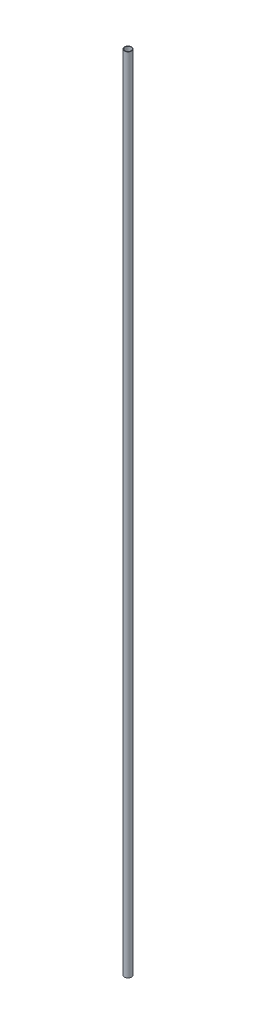
ISO-10303-21;
HEADER;
FILE_DESCRIPTION(('STEP AP214'),'2;1');
FILE_NAME('part.step','',(''),(''),'','','');
FILE_SCHEMA(('AUTOMOTIVE_DESIGN { 1 0 10303 214 1 1 1 1 }'));
ENDSEC;
DATA;
#1=APPLICATION_CONTEXT('core data for automotive mechanical design processes');
#2=APPLICATION_PROTOCOL_DEFINITION('international standard','automotive_design',2000,#1);
#3=PRODUCT_CONTEXT('',#1,'mechanical');
#4=PRODUCT('Part','Part','',(#3));
#5=PRODUCT_RELATED_PRODUCT_CATEGORY('part','',(#4));
#6=PRODUCT_DEFINITION_FORMATION('','',#4);
#7=PRODUCT_DEFINITION_CONTEXT('part definition',#1,'design');
#8=PRODUCT_DEFINITION('design','',#6,#7);
#9=PRODUCT_DEFINITION_SHAPE('','',#8);
#10=(LENGTH_UNIT() NAMED_UNIT(*) SI_UNIT(.MILLI.,.METRE.));
#11=(NAMED_UNIT(*) PLANE_ANGLE_UNIT() SI_UNIT($,.RADIAN.));
#12=(NAMED_UNIT(*) SI_UNIT($,.STERADIAN.) SOLID_ANGLE_UNIT());
#13=UNCERTAINTY_MEASURE_WITH_UNIT(LENGTH_MEASURE(1.E-05),#10,'distance_accuracy_value','');
#14=(GEOMETRIC_REPRESENTATION_CONTEXT(3) GLOBAL_UNCERTAINTY_ASSIGNED_CONTEXT((#13)) GLOBAL_UNIT_ASSIGNED_CONTEXT((#10,
#11,#12)) REPRESENTATION_CONTEXT('',''));
#15=CARTESIAN_POINT('',(0.,0.,0.));
#16=DIRECTION('',(0.,0.,1.));
#17=DIRECTION('',(1.,0.,0.));
#18=AXIS2_PLACEMENT_3D('',#15,#16,#17);
#19=CARTESIAN_POINT('',(0.,891.83,0.));
#20=DIRECTION('',(0.,1.,0.));
#21=DIRECTION('',(0.,0.,1.));
#22=AXIS2_PLACEMENT_3D('',#19,#20,#21);
#23=PLANE('',#22);
#24=CARTESIAN_POINT('',(0.,891.83,0.));
#25=DIRECTION('',(0.,1.,0.));
#26=DIRECTION('',(0.,0.,1.));
#27=AXIS2_PLACEMENT_3D('',#24,#25,#26);
#28=CIRCLE('',#27,4.);
#29=CARTESIAN_POINT('',(0.,891.83,4.));
#30=VERTEX_POINT('',#29);
#31=EDGE_CURVE('E10',#30,#30,#28,.T.);
#32=ORIENTED_EDGE('',*,*,#31,.T.);
#33=EDGE_LOOP('',(#32));
#34=FACE_BOUND('',#33,.T.);
#35=CARTESIAN_POINT('',(0.,891.83,0.));
#36=DIRECTION('',(0.,1.,0.));
#37=DIRECTION('',(0.,0.,1.));
#38=AXIS2_PLACEMENT_3D('',#35,#36,#37);
#39=CIRCLE('',#38,3.5);
#40=CARTESIAN_POINT('',(0.,891.83,3.5));
#41=VERTEX_POINT('',#40);
#42=EDGE_CURVE('E39',#41,#41,#39,.T.);
#43=ORIENTED_EDGE('',*,*,#42,.F.);
#44=EDGE_LOOP('',(#43));
#45=FACE_BOUND('',#44,.T.);
#46=ADVANCED_FACE('F28',(#34,#45),#23,.T.);
#47=CARTESIAN_POINT('',(0.,0.,0.));
#48=DIRECTION('',(0.,1.,0.));
#49=DIRECTION('',(0.,0.,1.));
#50=AXIS2_PLACEMENT_3D('',#47,#48,#49);
#51=PLANE('',#50);
#52=CARTESIAN_POINT('',(0.,0.,0.));
#53=DIRECTION('',(0.,1.,0.));
#54=DIRECTION('',(0.,0.,1.));
#55=AXIS2_PLACEMENT_3D('',#52,#53,#54);
#56=CIRCLE('',#55,4.);
#57=CARTESIAN_POINT('',(0.,0.,4.));
#58=VERTEX_POINT('',#57);
#59=EDGE_CURVE('E32',#58,#58,#56,.T.);
#60=ORIENTED_EDGE('',*,*,#59,.F.);
#61=EDGE_LOOP('',(#60));
#62=FACE_BOUND('',#61,.T.);
#63=CARTESIAN_POINT('',(0.,0.,0.));
#64=DIRECTION('',(0.,1.,0.));
#65=DIRECTION('',(0.,0.,1.));
#66=AXIS2_PLACEMENT_3D('',#63,#64,#65);
#67=CIRCLE('',#66,3.5);
#68=CARTESIAN_POINT('',(0.,0.,3.5));
#69=VERTEX_POINT('',#68);
#70=EDGE_CURVE('E41',#69,#69,#67,.T.);
#71=ORIENTED_EDGE('',*,*,#70,.T.);
#72=EDGE_LOOP('',(#71));
#73=FACE_BOUND('',#72,.T.);
#74=ADVANCED_FACE('F51',(#62,#73),#51,.F.);
#75=CARTESIAN_POINT('',(0.,891.83,0.));
#76=DIRECTION('',(0.,-1.,0.));
#77=DIRECTION('',(0.,0.,-1.));
#78=AXIS2_PLACEMENT_3D('',#75,#76,#77);
#79=CYLINDRICAL_SURFACE('',#78,4.);
#80=ORIENTED_EDGE('',*,*,#31,.F.);
#81=EDGE_LOOP('',(#80));
#82=FACE_BOUND('',#81,.T.);
#83=ORIENTED_EDGE('',*,*,#59,.T.);
#84=EDGE_LOOP('',(#83));
#85=FACE_BOUND('',#84,.T.);
#86=ADVANCED_FACE('F30',(#82,#85),#79,.T.);
#87=CARTESIAN_POINT('',(0.,891.83,0.));
#88=DIRECTION('',(0.,-1.,0.));
#89=DIRECTION('',(0.,0.,-1.));
#90=AXIS2_PLACEMENT_3D('',#87,#88,#89);
#91=CYLINDRICAL_SURFACE('',#90,3.5);
#92=ORIENTED_EDGE('',*,*,#42,.T.);
#93=EDGE_LOOP('',(#92));
#94=FACE_BOUND('',#93,.T.);
#95=ORIENTED_EDGE('',*,*,#70,.F.);
#96=EDGE_LOOP('',(#95));
#97=FACE_BOUND('',#96,.T.);
#98=ADVANCED_FACE('F47',(#94,#97),#91,.F.);
#99=CLOSED_SHELL('',(#46,#74,#86,#98));
#100=MANIFOLD_SOLID_BREP('B2',#99);
#101=ADVANCED_BREP_SHAPE_REPRESENTATION('',(#18,#100),#14);
#102=SHAPE_DEFINITION_REPRESENTATION(#9,#101);
ENDSEC;
END-ISO-10303-21;
